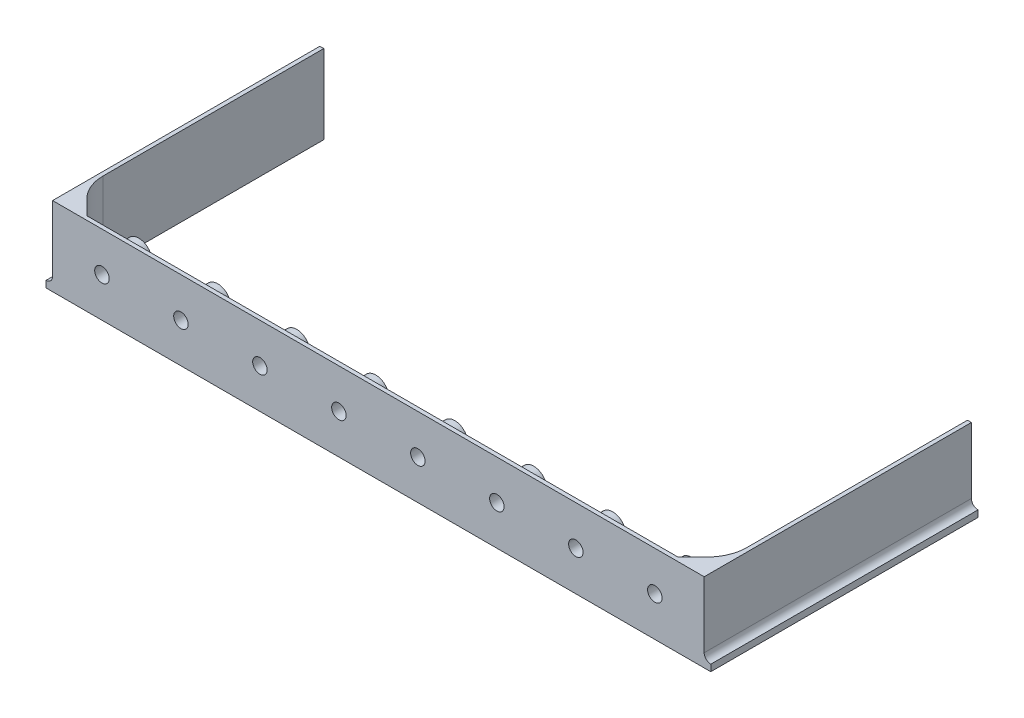
ISO-10303-21;
HEADER;
FILE_DESCRIPTION(('STEP AP214'),'2;1');
FILE_NAME('part.step','',(''),(''),'','','');
FILE_SCHEMA(('AUTOMOTIVE_DESIGN { 1 0 10303 214 1 1 1 1 }'));
ENDSEC;
DATA;
#1=APPLICATION_CONTEXT('core data for automotive mechanical design processes');
#2=APPLICATION_PROTOCOL_DEFINITION('international standard','automotive_design',2000,#1);
#3=PRODUCT_CONTEXT('',#1,'mechanical');
#4=PRODUCT('Part','Part','',(#3));
#5=PRODUCT_RELATED_PRODUCT_CATEGORY('part','',(#4));
#6=PRODUCT_DEFINITION_FORMATION('','',#4);
#7=PRODUCT_DEFINITION_CONTEXT('part definition',#1,'design');
#8=PRODUCT_DEFINITION('design','',#6,#7);
#9=PRODUCT_DEFINITION_SHAPE('','',#8);
#10=(LENGTH_UNIT() NAMED_UNIT(*) SI_UNIT(.MILLI.,.METRE.));
#11=(NAMED_UNIT(*) PLANE_ANGLE_UNIT() SI_UNIT($,.RADIAN.));
#12=(NAMED_UNIT(*) SI_UNIT($,.STERADIAN.) SOLID_ANGLE_UNIT());
#13=UNCERTAINTY_MEASURE_WITH_UNIT(LENGTH_MEASURE(1.E-05),#10,'distance_accuracy_value','');
#14=(GEOMETRIC_REPRESENTATION_CONTEXT(3) GLOBAL_UNCERTAINTY_ASSIGNED_CONTEXT((#13)) GLOBAL_UNIT_ASSIGNED_CONTEXT((#10,
#11,#12)) REPRESENTATION_CONTEXT('',''));
#15=CARTESIAN_POINT('',(0.,0.,0.));
#16=DIRECTION('',(0.,0.,1.));
#17=DIRECTION('',(1.,0.,0.));
#18=AXIS2_PLACEMENT_3D('',#15,#16,#17);
#19=CARTESIAN_POINT('',(495.,0.,3.));
#20=DIRECTION('',(-1.,0.,0.));
#21=DIRECTION('',(0.,0.,1.));
#22=AXIS2_PLACEMENT_3D('',#19,#20,#21);
#23=PLANE('',#22);
#24=DIRECTION('',(0.,1.,0.));
#25=VECTOR('',#24,1.);
#26=CARTESIAN_POINT('',(495.,0.,3.));
#27=LINE('',#26,#25);
#28=CARTESIAN_POINT('',(495.,10.,3.));
#29=VERTEX_POINT('',#28);
#30=CARTESIAN_POINT('',(495.,60.,3.));
#31=VERTEX_POINT('',#30);
#32=EDGE_CURVE('E170',#29,#31,#27,.T.);
#33=ORIENTED_EDGE('',*,*,#32,.F.);
#34=DIRECTION('',(0.,0.,1.));
#35=VECTOR('',#34,1.);
#36=CARTESIAN_POINT('',(495.,10.,-200.));
#37=LINE('',#36,#35);
#38=CARTESIAN_POINT('',(495.,10.,-200.));
#39=VERTEX_POINT('',#38);
#40=EDGE_CURVE('E69',#29,#39,#37,.F.);
#41=ORIENTED_EDGE('',*,*,#40,.T.);
#42=DIRECTION('',(0.,-1.,0.));
#43=VECTOR('',#42,1.);
#44=CARTESIAN_POINT('',(495.,60.,-200.));
#45=LINE('',#44,#43);
#46=CARTESIAN_POINT('',(495.,60.,-200.));
#47=VERTEX_POINT('',#46);
#48=EDGE_CURVE('E378',#47,#39,#45,.T.);
#49=ORIENTED_EDGE('',*,*,#48,.F.);
#50=DIRECTION('',(0.,0.,-1.));
#51=VECTOR('',#50,1.);
#52=CARTESIAN_POINT('',(495.,60.,3.));
#53=LINE('',#52,#51);
#54=EDGE_CURVE('E416',#31,#47,#53,.T.);
#55=ORIENTED_EDGE('',*,*,#54,.F.);
#56=EDGE_LOOP('',(#33,#41,#49,#55));
#57=FACE_BOUND('',#56,.T.);
#58=ADVANCED_FACE('F47',(#57),#23,.F.);
#59=CARTESIAN_POINT('',(0.,0.,3.));
#60=DIRECTION('',(1.,0.,0.));
#61=DIRECTION('',(0.,0.,-1.));
#62=AXIS2_PLACEMENT_3D('',#59,#60,#61);
#63=PLANE('',#62);
#64=DIRECTION('',(0.,1.,0.));
#65=VECTOR('',#64,1.);
#66=CARTESIAN_POINT('',(0.,60.,-200.));
#67=LINE('',#66,#65);
#68=CARTESIAN_POINT('',(0.,10.,-200.));
#69=VERTEX_POINT('',#68);
#70=CARTESIAN_POINT('',(0.,60.,-200.));
#71=VERTEX_POINT('',#70);
#72=EDGE_CURVE('E375',#69,#71,#67,.T.);
#73=ORIENTED_EDGE('',*,*,#72,.F.);
#74=DIRECTION('',(0.,0.,-1.));
#75=VECTOR('',#74,1.);
#76=CARTESIAN_POINT('',(0.,10.,3.));
#77=LINE('',#76,#75);
#78=CARTESIAN_POINT('',(0.,10.,3.));
#79=VERTEX_POINT('',#78);
#80=EDGE_CURVE('E445',#69,#79,#77,.F.);
#81=ORIENTED_EDGE('',*,*,#80,.T.);
#82=DIRECTION('',(0.,-1.,0.));
#83=VECTOR('',#82,1.);
#84=CARTESIAN_POINT('',(0.,0.,3.));
#85=LINE('',#84,#83);
#86=CARTESIAN_POINT('',(0.,60.,3.));
#87=VERTEX_POINT('',#86);
#88=EDGE_CURVE('E171',#87,#79,#85,.T.);
#89=ORIENTED_EDGE('',*,*,#88,.F.);
#90=DIRECTION('',(0.,0.,-1.));
#91=VECTOR('',#90,1.);
#92=CARTESIAN_POINT('',(0.,60.,3.));
#93=LINE('',#92,#91);
#94=EDGE_CURVE('E407',#87,#71,#93,.T.);
#95=ORIENTED_EDGE('',*,*,#94,.T.);
#96=EDGE_LOOP('',(#73,#81,#89,#95));
#97=FACE_BOUND('',#96,.T.);
#98=ADVANCED_FACE('F469',(#97),#63,.F.);
#99=CARTESIAN_POINT('',(0.,0.,0.));
#100=DIRECTION('',(0.,0.,-1.));
#101=DIRECTION('',(-1.,0.,0.));
#102=AXIS2_PLACEMENT_3D('',#99,#100,#101);
#103=PLANE('',#102);
#104=CARTESIAN_POINT('',(37.5,30.,0.));
#105=DIRECTION('',(0.,0.,-1.));
#106=DIRECTION('',(-1.,0.,0.));
#107=AXIS2_PLACEMENT_3D('',#104,#105,#106);
#108=CIRCLE('',#107,9.99999999999998);
#109=CARTESIAN_POINT('',(27.5000000000001,30.,0.));
#110=VERTEX_POINT('',#109);
#111=EDGE_CURVE('E214',#110,#110,#108,.T.);
#112=ORIENTED_EDGE('',*,*,#111,.F.);
#113=EDGE_LOOP('',(#112));
#114=FACE_BOUND('',#113,.T.);
#115=CARTESIAN_POINT('',(97.5,30.,0.));
#116=DIRECTION('',(0.,0.,-1.));
#117=DIRECTION('',(-1.,0.,0.));
#118=AXIS2_PLACEMENT_3D('',#115,#116,#117);
#119=CIRCLE('',#118,9.99999999999998);
#120=CARTESIAN_POINT('',(87.5000000000001,30.,0.));
#121=VERTEX_POINT('',#120);
#122=EDGE_CURVE('E270',#121,#121,#119,.T.);
#123=ORIENTED_EDGE('',*,*,#122,.F.);
#124=EDGE_LOOP('',(#123));
#125=FACE_BOUND('',#124,.T.);
#126=CARTESIAN_POINT('',(157.5,30.,0.));
#127=DIRECTION('',(0.,0.,-1.));
#128=DIRECTION('',(-1.,0.,0.));
#129=AXIS2_PLACEMENT_3D('',#126,#127,#128);
#130=CIRCLE('',#129,9.99999999999998);
#131=CARTESIAN_POINT('',(147.5,30.,0.));
#132=VERTEX_POINT('',#131);
#133=EDGE_CURVE('E278',#132,#132,#130,.T.);
#134=ORIENTED_EDGE('',*,*,#133,.F.);
#135=EDGE_LOOP('',(#134));
#136=FACE_BOUND('',#135,.T.);
#137=CARTESIAN_POINT('',(217.5,30.,0.));
#138=DIRECTION('',(0.,0.,-1.));
#139=DIRECTION('',(-1.,0.,0.));
#140=AXIS2_PLACEMENT_3D('',#137,#138,#139);
#141=CIRCLE('',#140,9.99999999999998);
#142=CARTESIAN_POINT('',(207.5,30.,0.));
#143=VERTEX_POINT('',#142);
#144=EDGE_CURVE('E286',#143,#143,#141,.T.);
#145=ORIENTED_EDGE('',*,*,#144,.F.);
#146=EDGE_LOOP('',(#145));
#147=FACE_BOUND('',#146,.T.);
#148=CARTESIAN_POINT('',(277.5,30.,0.));
#149=DIRECTION('',(0.,0.,-1.));
#150=DIRECTION('',(-1.,0.,0.));
#151=AXIS2_PLACEMENT_3D('',#148,#149,#150);
#152=CIRCLE('',#151,9.99999999999998);
#153=CARTESIAN_POINT('',(267.5,30.,0.));
#154=VERTEX_POINT('',#153);
#155=EDGE_CURVE('E294',#154,#154,#152,.T.);
#156=ORIENTED_EDGE('',*,*,#155,.F.);
#157=EDGE_LOOP('',(#156));
#158=FACE_BOUND('',#157,.T.);
#159=CARTESIAN_POINT('',(337.5,30.,0.));
#160=DIRECTION('',(0.,0.,-1.));
#161=DIRECTION('',(-1.,0.,0.));
#162=AXIS2_PLACEMENT_3D('',#159,#160,#161);
#163=CIRCLE('',#162,9.99999999999998);
#164=CARTESIAN_POINT('',(327.5,30.,0.));
#165=VERTEX_POINT('',#164);
#166=EDGE_CURVE('E302',#165,#165,#163,.T.);
#167=ORIENTED_EDGE('',*,*,#166,.F.);
#168=EDGE_LOOP('',(#167));
#169=FACE_BOUND('',#168,.T.);
#170=CARTESIAN_POINT('',(397.5,30.,0.));
#171=DIRECTION('',(0.,0.,-1.));
#172=DIRECTION('',(-1.,0.,0.));
#173=AXIS2_PLACEMENT_3D('',#170,#171,#172);
#174=CIRCLE('',#173,9.99999999999998);
#175=CARTESIAN_POINT('',(387.5,30.,0.));
#176=VERTEX_POINT('',#175);
#177=EDGE_CURVE('E310',#176,#176,#174,.T.);
#178=ORIENTED_EDGE('',*,*,#177,.F.);
#179=EDGE_LOOP('',(#178));
#180=FACE_BOUND('',#179,.T.);
#181=CARTESIAN_POINT('',(457.5,30.,0.));
#182=DIRECTION('',(0.,0.,-1.));
#183=DIRECTION('',(-1.,0.,0.));
#184=AXIS2_PLACEMENT_3D('',#181,#182,#183);
#185=CIRCLE('',#184,9.99999999999998);
#186=CARTESIAN_POINT('',(447.5,30.,0.));
#187=VERTEX_POINT('',#186);
#188=EDGE_CURVE('E326',#187,#187,#185,.T.);
#189=ORIENTED_EDGE('',*,*,#188,.F.);
#190=EDGE_LOOP('',(#189));
#191=FACE_BOUND('',#190,.T.);
#192=DIRECTION('',(0.,-1.,0.));
#193=VECTOR('',#192,1.);
#194=CARTESIAN_POINT('',(472.,60.,0.));
#195=LINE('',#194,#193);
#196=CARTESIAN_POINT('',(472.,60.,0.));
#197=VERTEX_POINT('',#196);
#198=CARTESIAN_POINT('',(472.,0.,0.));
#199=VERTEX_POINT('',#198);
#200=EDGE_CURVE('E334',#197,#199,#195,.T.);
#201=ORIENTED_EDGE('',*,*,#200,.T.);
#202=DIRECTION('',(1.,0.,0.));
#203=VECTOR('',#202,1.);
#204=CARTESIAN_POINT('',(0.,0.,0.));
#205=LINE('',#204,#203);
#206=CARTESIAN_POINT('',(23.,0.,0.));
#207=VERTEX_POINT('',#206);
#208=EDGE_CURVE('E398',#207,#199,#205,.T.);
#209=ORIENTED_EDGE('',*,*,#208,.F.);
#210=DIRECTION('',(0.,-1.,0.));
#211=VECTOR('',#210,1.);
#212=CARTESIAN_POINT('',(23.,60.,0.));
#213=LINE('',#212,#211);
#214=CARTESIAN_POINT('',(23.,60.,0.));
#215=VERTEX_POINT('',#214);
#216=EDGE_CURVE('E352',#215,#207,#213,.T.);
#217=ORIENTED_EDGE('',*,*,#216,.F.);
#218=DIRECTION('',(-1.,0.,0.));
#219=VECTOR('',#218,1.);
#220=CARTESIAN_POINT('',(0.,60.,0.));
#221=LINE('',#220,#219);
#222=EDGE_CURVE('E400',#197,#215,#221,.T.);
#223=ORIENTED_EDGE('',*,*,#222,.F.);
#224=EDGE_LOOP('',(#201,#209,#217,#223));
#225=FACE_BOUND('',#224,.T.);
#226=ADVANCED_FACE('F495',(#114,#125,#136,#147,#158,#169,#180,#191,#225),#103,.T.);
#227=CARTESIAN_POINT('',(0.,0.,3.));
#228=DIRECTION('',(0.,1.,0.));
#229=DIRECTION('',(0.,0.,1.));
#230=AXIS2_PLACEMENT_3D('',#227,#228,#229);
#231=PLANE('',#230);
#232=ORIENTED_EDGE('',*,*,#208,.T.);
#233=DIRECTION('',(0.707106781186548,0.,-0.707106781186547));
#234=VECTOR('',#233,1.);
#235=CARTESIAN_POINT('',(492.,0.,-20.));
#236=LINE('',#235,#234);
#237=CARTESIAN_POINT('',(483.213203435596,0.,-11.2132034355964));
#238=VERTEX_POINT('',#237);
#239=EDGE_CURVE('E341',#199,#238,#236,.T.);
#240=ORIENTED_EDGE('',*,*,#239,.T.);
#241=CARTESIAN_POINT('',(462.,0.,-32.4264068711928));
#242=DIRECTION('',(0.,1.,0.));
#243=DIRECTION('',(0.,0.,1.));
#244=AXIS2_PLACEMENT_3D('',#241,#242,#243);
#245=CIRCLE('',#244,30.);
#246=CARTESIAN_POINT('',(492.,0.,-32.4264068711928));
#247=VERTEX_POINT('',#246);
#248=EDGE_CURVE('E433',#238,#247,#245,.T.);
#249=ORIENTED_EDGE('',*,*,#248,.T.);
#250=DIRECTION('',(0.,0.,1.));
#251=VECTOR('',#250,1.);
#252=CARTESIAN_POINT('',(492.,0.,-200.));
#253=LINE('',#252,#251);
#254=CARTESIAN_POINT('',(492.,0.,-200.));
#255=VERTEX_POINT('',#254);
#256=EDGE_CURVE('E394',#255,#247,#253,.T.);
#257=ORIENTED_EDGE('',*,*,#256,.F.);
#258=DIRECTION('',(-1.,0.,0.));
#259=VECTOR('',#258,1.);
#260=CARTESIAN_POINT('',(495.,0.,-200.));
#261=LINE('',#260,#259);
#262=CARTESIAN_POINT('',(500.,0.,-200.));
#263=VERTEX_POINT('',#262);
#264=EDGE_CURVE('E178',#263,#255,#261,.T.);
#265=ORIENTED_EDGE('',*,*,#264,.F.);
#266=DIRECTION('',(0.,0.,-1.));
#267=VECTOR('',#266,1.);
#268=CARTESIAN_POINT('',(500.,0.,3.));
#269=LINE('',#268,#267);
#270=CARTESIAN_POINT('',(500.,0.,3.));
#271=VERTEX_POINT('',#270);
#272=EDGE_CURVE('E174',#271,#263,#269,.T.);
#273=ORIENTED_EDGE('',*,*,#272,.F.);
#274=DIRECTION('',(1.,0.,0.));
#275=VECTOR('',#274,1.);
#276=CARTESIAN_POINT('',(0.,0.,3.));
#277=LINE('',#276,#275);
#278=CARTESIAN_POINT('',(-5.,0.,3.));
#279=VERTEX_POINT('',#278);
#280=EDGE_CURVE('E158',#279,#271,#277,.T.);
#281=ORIENTED_EDGE('',*,*,#280,.F.);
#282=DIRECTION('',(0.,0.,1.));
#283=VECTOR('',#282,1.);
#284=CARTESIAN_POINT('',(-5.,0.,-200.));
#285=LINE('',#284,#283);
#286=CARTESIAN_POINT('',(-5.,0.,-200.));
#287=VERTEX_POINT('',#286);
#288=EDGE_CURVE('E200',#287,#279,#285,.T.);
#289=ORIENTED_EDGE('',*,*,#288,.F.);
#290=DIRECTION('',(-1.,0.,0.));
#291=VECTOR('',#290,1.);
#292=CARTESIAN_POINT('',(0.,0.,-200.));
#293=LINE('',#292,#291);
#294=CARTESIAN_POINT('',(2.99999999999999,0.,-200.));
#295=VERTEX_POINT('',#294);
#296=EDGE_CURVE('E366',#295,#287,#293,.T.);
#297=ORIENTED_EDGE('',*,*,#296,.F.);
#298=DIRECTION('',(0.,0.,1.));
#299=VECTOR('',#298,1.);
#300=CARTESIAN_POINT('',(2.99999999999999,0.,-200.));
#301=LINE('',#300,#299);
#302=CARTESIAN_POINT('',(2.99999999999999,0.,-32.4264068711928));
#303=VERTEX_POINT('',#302);
#304=EDGE_CURVE('E362',#295,#303,#301,.T.);
#305=ORIENTED_EDGE('',*,*,#304,.T.);
#306=CARTESIAN_POINT('',(33.,0.,-32.4264068711928));
#307=DIRECTION('',(0.,1.,0.));
#308=DIRECTION('',(0.,0.,1.));
#309=AXIS2_PLACEMENT_3D('',#306,#307,#308);
#310=CIRCLE('',#309,30.);
#311=CARTESIAN_POINT('',(11.7867965644036,0.,-11.2132034355964));
#312=VERTEX_POINT('',#311);
#313=EDGE_CURVE('E439',#303,#312,#310,.T.);
#314=ORIENTED_EDGE('',*,*,#313,.T.);
#315=DIRECTION('',(0.707106781186548,0.,0.707106781186548));
#316=VECTOR('',#315,1.);
#317=CARTESIAN_POINT('',(2.99999999999999,0.,-20.));
#318=LINE('',#317,#316);
#319=EDGE_CURVE('E345',#312,#207,#318,.T.);
#320=ORIENTED_EDGE('',*,*,#319,.T.);
#321=EDGE_LOOP('',(#232,#240,#249,#257,#265,#273,#281,#289,#297,#305,#314,#320));
#322=FACE_BOUND('',#321,.T.);
#323=ADVANCED_FACE('F176',(#322),#231,.F.);
#324=CARTESIAN_POINT('',(0.,60.,3.));
#325=DIRECTION('',(0.,-1.,0.));
#326=DIRECTION('',(0.,0.,-1.));
#327=AXIS2_PLACEMENT_3D('',#324,#325,#326);
#328=PLANE('',#327);
#329=DIRECTION('',(0.707106781186548,0.,-0.707106781186547));
#330=VECTOR('',#329,1.);
#331=CARTESIAN_POINT('',(492.,60.,-20.));
#332=LINE('',#331,#330);
#333=CARTESIAN_POINT('',(483.213203435596,60.,-11.2132034355964));
#334=VERTEX_POINT('',#333);
#335=EDGE_CURVE('E340',#197,#334,#332,.T.);
#336=ORIENTED_EDGE('',*,*,#335,.F.);
#337=ORIENTED_EDGE('',*,*,#222,.T.);
#338=DIRECTION('',(0.707106781186548,0.,0.707106781186548));
#339=VECTOR('',#338,1.);
#340=CARTESIAN_POINT('',(2.99999999999999,60.,-20.));
#341=LINE('',#340,#339);
#342=CARTESIAN_POINT('',(11.7867965644036,60.,-11.2132034355964));
#343=VERTEX_POINT('',#342);
#344=EDGE_CURVE('E349',#343,#215,#341,.T.);
#345=ORIENTED_EDGE('',*,*,#344,.F.);
#346=CARTESIAN_POINT('',(33.,60.,-32.4264068711928));
#347=DIRECTION('',(0.,-1.,0.));
#348=DIRECTION('',(0.,0.,-1.));
#349=AXIS2_PLACEMENT_3D('',#346,#347,#348);
#350=CIRCLE('',#349,30.);
#351=CARTESIAN_POINT('',(3.,60.,-32.4264068711928));
#352=VERTEX_POINT('',#351);
#353=EDGE_CURVE('E442',#343,#352,#350,.T.);
#354=ORIENTED_EDGE('',*,*,#353,.T.);
#355=DIRECTION('',(0.,0.,1.));
#356=VECTOR('',#355,1.);
#357=CARTESIAN_POINT('',(3.,60.,-200.));
#358=LINE('',#357,#356);
#359=CARTESIAN_POINT('',(3.,60.,-200.));
#360=VERTEX_POINT('',#359);
#361=EDGE_CURVE('E358',#360,#352,#358,.T.);
#362=ORIENTED_EDGE('',*,*,#361,.F.);
#363=DIRECTION('',(1.,0.,0.));
#364=VECTOR('',#363,1.);
#365=CARTESIAN_POINT('',(0.,60.,-200.));
#366=LINE('',#365,#364);
#367=EDGE_CURVE('E372',#71,#360,#366,.T.);
#368=ORIENTED_EDGE('',*,*,#367,.F.);
#369=ORIENTED_EDGE('',*,*,#94,.F.);
#370=DIRECTION('',(-1.,0.,0.));
#371=VECTOR('',#370,1.);
#372=CARTESIAN_POINT('',(0.,60.,3.));
#373=LINE('',#372,#371);
#374=EDGE_CURVE('E404',#31,#87,#373,.T.);
#375=ORIENTED_EDGE('',*,*,#374,.F.);
#376=ORIENTED_EDGE('',*,*,#54,.T.);
#377=DIRECTION('',(1.,0.,0.));
#378=VECTOR('',#377,1.);
#379=CARTESIAN_POINT('',(495.,60.,-200.));
#380=LINE('',#379,#378);
#381=CARTESIAN_POINT('',(492.,60.,-200.));
#382=VERTEX_POINT('',#381);
#383=EDGE_CURVE('E386',#382,#47,#380,.T.);
#384=ORIENTED_EDGE('',*,*,#383,.F.);
#385=DIRECTION('',(0.,0.,1.));
#386=VECTOR('',#385,1.);
#387=CARTESIAN_POINT('',(492.,60.,-200.));
#388=LINE('',#387,#386);
#389=CARTESIAN_POINT('',(492.,60.,-32.4264068711928));
#390=VERTEX_POINT('',#389);
#391=EDGE_CURVE('E390',#382,#390,#388,.T.);
#392=ORIENTED_EDGE('',*,*,#391,.T.);
#393=CARTESIAN_POINT('',(462.,60.,-32.4264068711928));
#394=DIRECTION('',(0.,-1.,0.));
#395=DIRECTION('',(0.,0.,-1.));
#396=AXIS2_PLACEMENT_3D('',#393,#394,#395);
#397=CIRCLE('',#396,30.);
#398=EDGE_CURVE('E436',#390,#334,#397,.T.);
#399=ORIENTED_EDGE('',*,*,#398,.T.);
#400=EDGE_LOOP('',(#336,#337,#345,#354,#362,#368,#369,#375,#376,#384,#392,#399));
#401=FACE_BOUND('',#400,.T.);
#402=ADVANCED_FACE('F476',(#401),#328,.F.);
#403=CARTESIAN_POINT('',(0.,0.,3.));
#404=DIRECTION('',(0.,0.,-1.));
#405=DIRECTION('',(-1.,0.,0.));
#406=AXIS2_PLACEMENT_3D('',#403,#404,#405);
#407=PLANE('',#406);
#408=CARTESIAN_POINT('',(397.5,30.,3.));
#409=DIRECTION('',(0.,0.,-1.));
#410=DIRECTION('',(-1.,0.,0.));
#411=AXIS2_PLACEMENT_3D('',#408,#409,#410);
#412=CIRCLE('',#411,5.50000000000002);
#413=CARTESIAN_POINT('',(392.,30.,3.));
#414=VERTEX_POINT('',#413);
#415=EDGE_CURVE('E210',#414,#414,#412,.T.);
#416=ORIENTED_EDGE('',*,*,#415,.T.);
#417=EDGE_LOOP('',(#416));
#418=FACE_BOUND('',#417,.T.);
#419=CARTESIAN_POINT('',(337.5,30.,3.));
#420=DIRECTION('',(0.,0.,-1.));
#421=DIRECTION('',(-1.,0.,0.));
#422=AXIS2_PLACEMENT_3D('',#419,#420,#421);
#423=CIRCLE('',#422,5.50000000000002);
#424=CARTESIAN_POINT('',(332.,30.,3.));
#425=VERTEX_POINT('',#424);
#426=EDGE_CURVE('E219',#425,#425,#423,.T.);
#427=ORIENTED_EDGE('',*,*,#426,.T.);
#428=EDGE_LOOP('',(#427));
#429=FACE_BOUND('',#428,.T.);
#430=CARTESIAN_POINT('',(277.5,30.,3.));
#431=DIRECTION('',(0.,0.,-1.));
#432=DIRECTION('',(-1.,0.,0.));
#433=AXIS2_PLACEMENT_3D('',#430,#431,#432);
#434=CIRCLE('',#433,5.50000000000002);
#435=CARTESIAN_POINT('',(272.,30.,3.));
#436=VERTEX_POINT('',#435);
#437=EDGE_CURVE('E227',#436,#436,#434,.T.);
#438=ORIENTED_EDGE('',*,*,#437,.T.);
#439=EDGE_LOOP('',(#438));
#440=FACE_BOUND('',#439,.T.);
#441=CARTESIAN_POINT('',(217.5,30.,3.));
#442=DIRECTION('',(0.,0.,-1.));
#443=DIRECTION('',(-1.,0.,0.));
#444=AXIS2_PLACEMENT_3D('',#441,#442,#443);
#445=CIRCLE('',#444,5.50000000000002);
#446=CARTESIAN_POINT('',(212.,30.,3.));
#447=VERTEX_POINT('',#446);
#448=EDGE_CURVE('E235',#447,#447,#445,.T.);
#449=ORIENTED_EDGE('',*,*,#448,.T.);
#450=EDGE_LOOP('',(#449));
#451=FACE_BOUND('',#450,.T.);
#452=CARTESIAN_POINT('',(157.5,30.,3.));
#453=DIRECTION('',(0.,0.,-1.));
#454=DIRECTION('',(-1.,0.,0.));
#455=AXIS2_PLACEMENT_3D('',#452,#453,#454);
#456=CIRCLE('',#455,5.50000000000002);
#457=CARTESIAN_POINT('',(152.,30.,3.));
#458=VERTEX_POINT('',#457);
#459=EDGE_CURVE('E243',#458,#458,#456,.T.);
#460=ORIENTED_EDGE('',*,*,#459,.T.);
#461=EDGE_LOOP('',(#460));
#462=FACE_BOUND('',#461,.T.);
#463=CARTESIAN_POINT('',(97.5,30.,3.));
#464=DIRECTION('',(0.,0.,-1.));
#465=DIRECTION('',(-1.,0.,0.));
#466=AXIS2_PLACEMENT_3D('',#463,#464,#465);
#467=CIRCLE('',#466,5.50000000000002);
#468=CARTESIAN_POINT('',(92.,30.,3.));
#469=VERTEX_POINT('',#468);
#470=EDGE_CURVE('E251',#469,#469,#467,.T.);
#471=ORIENTED_EDGE('',*,*,#470,.T.);
#472=EDGE_LOOP('',(#471));
#473=FACE_BOUND('',#472,.T.);
#474=CARTESIAN_POINT('',(37.5,30.,3.));
#475=DIRECTION('',(0.,0.,-1.));
#476=DIRECTION('',(-1.,0.,0.));
#477=AXIS2_PLACEMENT_3D('',#474,#475,#476);
#478=CIRCLE('',#477,5.50000000000002);
#479=CARTESIAN_POINT('',(32.,30.,3.));
#480=VERTEX_POINT('',#479);
#481=EDGE_CURVE('E259',#480,#480,#478,.T.);
#482=ORIENTED_EDGE('',*,*,#481,.T.);
#483=EDGE_LOOP('',(#482));
#484=FACE_BOUND('',#483,.T.);
#485=CARTESIAN_POINT('',(457.5,30.,3.));
#486=DIRECTION('',(0.,0.,-1.));
#487=DIRECTION('',(-1.,0.,0.));
#488=AXIS2_PLACEMENT_3D('',#485,#486,#487);
#489=CIRCLE('',#488,5.50000000000002);
#490=CARTESIAN_POINT('',(452.,30.,3.));
#491=VERTEX_POINT('',#490);
#492=EDGE_CURVE('E322',#491,#491,#489,.T.);
#493=ORIENTED_EDGE('',*,*,#492,.T.);
#494=EDGE_LOOP('',(#493));
#495=FACE_BOUND('',#494,.T.);
#496=ORIENTED_EDGE('',*,*,#88,.T.);
#497=CARTESIAN_POINT('',(-5.,10.,3.));
#498=DIRECTION('',(0.,0.,-1.));
#499=DIRECTION('',(-1.,0.,0.));
#500=AXIS2_PLACEMENT_3D('',#497,#498,#499);
#501=CIRCLE('',#500,5.);
#502=CARTESIAN_POINT('',(-5.,5.,3.));
#503=VERTEX_POINT('',#502);
#504=EDGE_CURVE('E451',#79,#503,#501,.T.);
#505=ORIENTED_EDGE('',*,*,#504,.T.);
#506=DIRECTION('',(0.,1.,0.));
#507=VECTOR('',#506,1.);
#508=CARTESIAN_POINT('',(-5.,0.,3.));
#509=LINE('',#508,#507);
#510=EDGE_CURVE('E165',#279,#503,#509,.T.);
#511=ORIENTED_EDGE('',*,*,#510,.F.);
#512=ORIENTED_EDGE('',*,*,#280,.T.);
#513=DIRECTION('',(0.,-1.,0.));
#514=VECTOR('',#513,1.);
#515=CARTESIAN_POINT('',(500.,0.,3.));
#516=LINE('',#515,#514);
#517=CARTESIAN_POINT('',(500.,5.,3.));
#518=VERTEX_POINT('',#517);
#519=EDGE_CURVE('E163',#518,#271,#516,.T.);
#520=ORIENTED_EDGE('',*,*,#519,.F.);
#521=CARTESIAN_POINT('',(500.,10.,3.));
#522=DIRECTION('',(0.,0.,-1.));
#523=DIRECTION('',(-1.,0.,0.));
#524=AXIS2_PLACEMENT_3D('',#521,#522,#523);
#525=CIRCLE('',#524,5.);
#526=EDGE_CURVE('E56',#518,#29,#525,.T.);
#527=ORIENTED_EDGE('',*,*,#526,.T.);
#528=ORIENTED_EDGE('',*,*,#32,.T.);
#529=ORIENTED_EDGE('',*,*,#374,.T.);
#530=EDGE_LOOP('',(#496,#505,#511,#512,#520,#527,#528,#529));
#531=FACE_BOUND('',#530,.T.);
#532=ADVANCED_FACE('F161',(#418,#429,#440,#451,#462,#473,#484,#495,#531),#407,.F.);
#533=CARTESIAN_POINT('',(492.,60.,-200.));
#534=DIRECTION('',(1.,0.,0.));
#535=DIRECTION('',(0.,0.,-1.));
#536=AXIS2_PLACEMENT_3D('',#533,#534,#535);
#537=PLANE('',#536);
#538=ORIENTED_EDGE('',*,*,#256,.T.);
#539=DIRECTION('',(0.,-1.,0.));
#540=VECTOR('',#539,1.);
#541=CARTESIAN_POINT('',(492.,60.,-32.4264068711928));
#542=LINE('',#541,#540);
#543=EDGE_CURVE('E423',#247,#390,#542,.F.);
#544=ORIENTED_EDGE('',*,*,#543,.T.);
#545=ORIENTED_EDGE('',*,*,#391,.F.);
#546=DIRECTION('',(0.,1.,0.));
#547=VECTOR('',#546,1.);
#548=CARTESIAN_POINT('',(492.,60.,-200.));
#549=LINE('',#548,#547);
#550=EDGE_CURVE('E383',#255,#382,#549,.T.);
#551=ORIENTED_EDGE('',*,*,#550,.F.);
#552=EDGE_LOOP('',(#538,#544,#545,#551));
#553=FACE_BOUND('',#552,.T.);
#554=ADVANCED_FACE('F506',(#553),#537,.F.);
#555=CARTESIAN_POINT('',(0.,0.,-200.));
#556=DIRECTION('',(0.,0.,-1.));
#557=DIRECTION('',(-1.,0.,0.));
#558=AXIS2_PLACEMENT_3D('',#555,#556,#557);
#559=PLANE('',#558);
#560=ORIENTED_EDGE('',*,*,#48,.T.);
#561=CARTESIAN_POINT('',(500.,10.,-200.));
#562=DIRECTION('',(0.,0.,-1.));
#563=DIRECTION('',(-1.,0.,0.));
#564=AXIS2_PLACEMENT_3D('',#561,#562,#563);
#565=CIRCLE('',#564,5.);
#566=CARTESIAN_POINT('',(500.,5.,-200.));
#567=VERTEX_POINT('',#566);
#568=EDGE_CURVE('E11',#39,#567,#565,.F.);
#569=ORIENTED_EDGE('',*,*,#568,.T.);
#570=DIRECTION('',(0.,1.,0.));
#571=VECTOR('',#570,1.);
#572=CARTESIAN_POINT('',(500.,0.,-200.));
#573=LINE('',#572,#571);
#574=EDGE_CURVE('E183',#263,#567,#573,.T.);
#575=ORIENTED_EDGE('',*,*,#574,.F.);
#576=ORIENTED_EDGE('',*,*,#264,.T.);
#577=ORIENTED_EDGE('',*,*,#550,.T.);
#578=ORIENTED_EDGE('',*,*,#383,.T.);
#579=EDGE_LOOP('',(#560,#569,#575,#576,#577,#578));
#580=FACE_BOUND('',#579,.T.);
#581=ADVANCED_FACE('F510',(#580),#559,.T.);
#582=CARTESIAN_POINT('',(3.,60.,-200.));
#583=DIRECTION('',(-1.,0.,0.));
#584=DIRECTION('',(0.,-1.,0.));
#585=AXIS2_PLACEMENT_3D('',#582,#583,#584);
#586=PLANE('',#585);
#587=ORIENTED_EDGE('',*,*,#361,.T.);
#588=DIRECTION('',(0.,-1.,0.));
#589=VECTOR('',#588,1.);
#590=CARTESIAN_POINT('',(3.,60.,-32.4264068711928));
#591=LINE('',#590,#589);
#592=EDGE_CURVE('E426',#352,#303,#591,.T.);
#593=ORIENTED_EDGE('',*,*,#592,.T.);
#594=ORIENTED_EDGE('',*,*,#304,.F.);
#595=DIRECTION('',(0.,-1.,0.));
#596=VECTOR('',#595,1.);
#597=CARTESIAN_POINT('',(3.,60.,-200.));
#598=LINE('',#597,#596);
#599=EDGE_CURVE('E369',#360,#295,#598,.T.);
#600=ORIENTED_EDGE('',*,*,#599,.F.);
#601=EDGE_LOOP('',(#587,#593,#594,#600));
#602=FACE_BOUND('',#601,.T.);
#603=ADVANCED_FACE('F481',(#602),#586,.F.);
#604=CARTESIAN_POINT('',(0.,0.,-200.));
#605=DIRECTION('',(0.,0.,1.));
#606=DIRECTION('',(1.,0.,0.));
#607=AXIS2_PLACEMENT_3D('',#604,#605,#606);
#608=PLANE('',#607);
#609=ORIENTED_EDGE('',*,*,#296,.T.);
#610=DIRECTION('',(0.,-1.,0.));
#611=VECTOR('',#610,1.);
#612=CARTESIAN_POINT('',(-5.,0.,-200.));
#613=LINE('',#612,#611);
#614=CARTESIAN_POINT('',(-5.,5.,-200.));
#615=VERTEX_POINT('',#614);
#616=EDGE_CURVE('E196',#615,#287,#613,.T.);
#617=ORIENTED_EDGE('',*,*,#616,.F.);
#618=CARTESIAN_POINT('',(-5.,10.,-200.));
#619=DIRECTION('',(0.,0.,1.));
#620=DIRECTION('',(1.,0.,0.));
#621=AXIS2_PLACEMENT_3D('',#618,#619,#620);
#622=CIRCLE('',#621,5.);
#623=EDGE_CURVE('E448',#615,#69,#622,.T.);
#624=ORIENTED_EDGE('',*,*,#623,.T.);
#625=ORIENTED_EDGE('',*,*,#72,.T.);
#626=ORIENTED_EDGE('',*,*,#367,.T.);
#627=ORIENTED_EDGE('',*,*,#599,.T.);
#628=EDGE_LOOP('',(#609,#617,#624,#625,#626,#627));
#629=FACE_BOUND('',#628,.T.);
#630=ADVANCED_FACE('F467',(#629),#608,.F.);
#631=CARTESIAN_POINT('',(2.99999999999999,60.,-20.));
#632=DIRECTION('',(0.707106781186547,0.,-0.707106781186547));
#633=DIRECTION('',(-0.707106781186548,0.,-0.707106781186548));
#634=AXIS2_PLACEMENT_3D('',#631,#632,#633);
#635=PLANE('',#634);
#636=ORIENTED_EDGE('',*,*,#319,.F.);
#637=DIRECTION('',(0.,-1.,0.));
#638=VECTOR('',#637,1.);
#639=CARTESIAN_POINT('',(11.7867965644036,60.,-11.2132034355964));
#640=LINE('',#639,#638);
#641=EDGE_CURVE('E430',#312,#343,#640,.F.);
#642=ORIENTED_EDGE('',*,*,#641,.T.);
#643=ORIENTED_EDGE('',*,*,#344,.T.);
#644=ORIENTED_EDGE('',*,*,#216,.T.);
#645=EDGE_LOOP('',(#636,#642,#643,#644));
#646=FACE_BOUND('',#645,.T.);
#647=ADVANCED_FACE('F487',(#646),#635,.T.);
#648=CARTESIAN_POINT('',(492.,60.,-20.));
#649=DIRECTION('',(-0.707106781186547,0.,-0.707106781186548));
#650=DIRECTION('',(-0.707106781186548,0.,0.707106781186547));
#651=AXIS2_PLACEMENT_3D('',#648,#649,#650);
#652=PLANE('',#651);
#653=ORIENTED_EDGE('',*,*,#335,.T.);
#654=DIRECTION('',(0.,-1.,0.));
#655=VECTOR('',#654,1.);
#656=CARTESIAN_POINT('',(483.213203435596,60.,-11.2132034355964));
#657=LINE('',#656,#655);
#658=EDGE_CURVE('E419',#334,#238,#657,.T.);
#659=ORIENTED_EDGE('',*,*,#658,.T.);
#660=ORIENTED_EDGE('',*,*,#239,.F.);
#661=ORIENTED_EDGE('',*,*,#200,.F.);
#662=EDGE_LOOP('',(#653,#659,#660,#661));
#663=FACE_BOUND('',#662,.T.);
#664=ADVANCED_FACE('F498',(#663),#652,.T.);
#665=CARTESIAN_POINT('',(457.5,30.,-25.));
#666=DIRECTION('',(0.,0.,1.));
#667=DIRECTION('',(1.,0.,0.));
#668=AXIS2_PLACEMENT_3D('',#665,#666,#667);
#669=CYLINDRICAL_SURFACE('',#668,9.99999999999998);
#670=CARTESIAN_POINT('',(457.5,30.,-25.));
#671=DIRECTION('',(0.,0.,-1.));
#672=DIRECTION('',(-1.,0.,0.));
#673=AXIS2_PLACEMENT_3D('',#670,#671,#672);
#674=CIRCLE('',#673,9.99999999999998);
#675=CARTESIAN_POINT('',(447.5,30.,-25.));
#676=VERTEX_POINT('',#675);
#677=EDGE_CURVE('E330',#676,#676,#674,.T.);
#678=ORIENTED_EDGE('',*,*,#677,.F.);
#679=EDGE_LOOP('',(#678));
#680=FACE_BOUND('',#679,.T.);
#681=ORIENTED_EDGE('',*,*,#188,.T.);
#682=EDGE_LOOP('',(#681));
#683=FACE_BOUND('',#682,.T.);
#684=ADVANCED_FACE('F633',(#680,#683),#669,.T.);
#685=CARTESIAN_POINT('',(457.5,30.,-25.));
#686=DIRECTION('',(0.,0.,-1.));
#687=DIRECTION('',(-1.,0.,0.));
#688=AXIS2_PLACEMENT_3D('',#685,#686,#687);
#689=PLANE('',#688);
#690=CARTESIAN_POINT('',(457.5,30.,-25.));
#691=DIRECTION('',(0.,0.,-1.));
#692=DIRECTION('',(-1.,0.,0.));
#693=AXIS2_PLACEMENT_3D('',#690,#691,#692);
#694=CIRCLE('',#693,5.50000000000002);
#695=CARTESIAN_POINT('',(452.,30.,-25.));
#696=VERTEX_POINT('',#695);
#697=EDGE_CURVE('E318',#696,#696,#694,.T.);
#698=ORIENTED_EDGE('',*,*,#697,.F.);
#699=EDGE_LOOP('',(#698));
#700=FACE_BOUND('',#699,.T.);
#701=ORIENTED_EDGE('',*,*,#677,.T.);
#702=EDGE_LOOP('',(#701));
#703=FACE_BOUND('',#702,.T.);
#704=ADVANCED_FACE('F629',(#700,#703),#689,.T.);
#705=CARTESIAN_POINT('',(457.5,30.,3.));
#706=DIRECTION('',(0.,0.,-1.));
#707=DIRECTION('',(-1.,0.,0.));
#708=AXIS2_PLACEMENT_3D('',#705,#706,#707);
#709=CYLINDRICAL_SURFACE('',#708,5.50000000000002);
#710=ORIENTED_EDGE('',*,*,#492,.F.);
#711=EDGE_LOOP('',(#710));
#712=FACE_BOUND('',#711,.T.);
#713=ORIENTED_EDGE('',*,*,#697,.T.);
#714=EDGE_LOOP('',(#713));
#715=FACE_BOUND('',#714,.T.);
#716=ADVANCED_FACE('F625',(#712,#715),#709,.F.);
#717=CARTESIAN_POINT('',(397.5,30.,-25.));
#718=DIRECTION('',(0.,0.,1.));
#719=DIRECTION('',(1.,0.,0.));
#720=AXIS2_PLACEMENT_3D('',#717,#718,#719);
#721=CYLINDRICAL_SURFACE('',#720,9.99999999999998);
#722=CARTESIAN_POINT('',(397.5,30.,-25.));
#723=DIRECTION('',(0.,0.,-1.));
#724=DIRECTION('',(-1.,0.,0.));
#725=AXIS2_PLACEMENT_3D('',#722,#723,#724);
#726=CIRCLE('',#725,9.99999999999998);
#727=CARTESIAN_POINT('',(387.5,30.,-25.));
#728=VERTEX_POINT('',#727);
#729=EDGE_CURVE('E314',#728,#728,#726,.T.);
#730=ORIENTED_EDGE('',*,*,#729,.F.);
#731=EDGE_LOOP('',(#730));
#732=FACE_BOUND('',#731,.T.);
#733=ORIENTED_EDGE('',*,*,#177,.T.);
#734=EDGE_LOOP('',(#733));
#735=FACE_BOUND('',#734,.T.);
#736=ADVANCED_FACE('F621',(#732,#735),#721,.T.);
#737=CARTESIAN_POINT('',(397.5,30.,-25.));
#738=DIRECTION('',(0.,0.,-1.));
#739=DIRECTION('',(-1.,0.,0.));
#740=AXIS2_PLACEMENT_3D('',#737,#738,#739);
#741=PLANE('',#740);
#742=CARTESIAN_POINT('',(397.5,30.,-25.));
#743=DIRECTION('',(0.,0.,-1.));
#744=DIRECTION('',(-1.,0.,0.));
#745=AXIS2_PLACEMENT_3D('',#742,#743,#744);
#746=CIRCLE('',#745,5.50000000000002);
#747=CARTESIAN_POINT('',(392.,30.,-25.));
#748=VERTEX_POINT('',#747);
#749=EDGE_CURVE('E215',#748,#748,#746,.T.);
#750=ORIENTED_EDGE('',*,*,#749,.F.);
#751=EDGE_LOOP('',(#750));
#752=FACE_BOUND('',#751,.T.);
#753=ORIENTED_EDGE('',*,*,#729,.T.);
#754=EDGE_LOOP('',(#753));
#755=FACE_BOUND('',#754,.T.);
#756=ADVANCED_FACE('F617',(#752,#755),#741,.T.);
#757=CARTESIAN_POINT('',(337.5,30.,-25.));
#758=DIRECTION('',(0.,0.,1.));
#759=DIRECTION('',(1.,0.,0.));
#760=AXIS2_PLACEMENT_3D('',#757,#758,#759);
#761=CYLINDRICAL_SURFACE('',#760,9.99999999999998);
#762=CARTESIAN_POINT('',(337.5,30.,-25.));
#763=DIRECTION('',(0.,0.,-1.));
#764=DIRECTION('',(-1.,0.,0.));
#765=AXIS2_PLACEMENT_3D('',#762,#763,#764);
#766=CIRCLE('',#765,9.99999999999998);
#767=CARTESIAN_POINT('',(327.5,30.,-25.));
#768=VERTEX_POINT('',#767);
#769=EDGE_CURVE('E306',#768,#768,#766,.T.);
#770=ORIENTED_EDGE('',*,*,#769,.F.);
#771=EDGE_LOOP('',(#770));
#772=FACE_BOUND('',#771,.T.);
#773=ORIENTED_EDGE('',*,*,#166,.T.);
#774=EDGE_LOOP('',(#773));
#775=FACE_BOUND('',#774,.T.);
#776=ADVANCED_FACE('F613',(#772,#775),#761,.T.);
#777=CARTESIAN_POINT('',(337.5,30.,-25.));
#778=DIRECTION('',(0.,0.,-1.));
#779=DIRECTION('',(-1.,0.,0.));
#780=AXIS2_PLACEMENT_3D('',#777,#778,#779);
#781=PLANE('',#780);
#782=CARTESIAN_POINT('',(337.5,30.,-25.));
#783=DIRECTION('',(0.,0.,-1.));
#784=DIRECTION('',(-1.,0.,0.));
#785=AXIS2_PLACEMENT_3D('',#782,#783,#784);
#786=CIRCLE('',#785,5.50000000000002);
#787=CARTESIAN_POINT('',(332.,30.,-25.));
#788=VERTEX_POINT('',#787);
#789=EDGE_CURVE('E223',#788,#788,#786,.T.);
#790=ORIENTED_EDGE('',*,*,#789,.F.);
#791=EDGE_LOOP('',(#790));
#792=FACE_BOUND('',#791,.T.);
#793=ORIENTED_EDGE('',*,*,#769,.T.);
#794=EDGE_LOOP('',(#793));
#795=FACE_BOUND('',#794,.T.);
#796=ADVANCED_FACE('F609',(#792,#795),#781,.T.);
#797=CARTESIAN_POINT('',(277.5,30.,-25.));
#798=DIRECTION('',(0.,0.,1.));
#799=DIRECTION('',(1.,0.,0.));
#800=AXIS2_PLACEMENT_3D('',#797,#798,#799);
#801=CYLINDRICAL_SURFACE('',#800,9.99999999999998);
#802=CARTESIAN_POINT('',(277.5,30.,-25.));
#803=DIRECTION('',(0.,0.,-1.));
#804=DIRECTION('',(-1.,0.,0.));
#805=AXIS2_PLACEMENT_3D('',#802,#803,#804);
#806=CIRCLE('',#805,9.99999999999998);
#807=CARTESIAN_POINT('',(267.5,30.,-25.));
#808=VERTEX_POINT('',#807);
#809=EDGE_CURVE('E298',#808,#808,#806,.T.);
#810=ORIENTED_EDGE('',*,*,#809,.F.);
#811=EDGE_LOOP('',(#810));
#812=FACE_BOUND('',#811,.T.);
#813=ORIENTED_EDGE('',*,*,#155,.T.);
#814=EDGE_LOOP('',(#813));
#815=FACE_BOUND('',#814,.T.);
#816=ADVANCED_FACE('F605',(#812,#815),#801,.T.);
#817=CARTESIAN_POINT('',(277.5,30.,-25.));
#818=DIRECTION('',(0.,0.,-1.));
#819=DIRECTION('',(-1.,0.,0.));
#820=AXIS2_PLACEMENT_3D('',#817,#818,#819);
#821=PLANE('',#820);
#822=CARTESIAN_POINT('',(277.5,30.,-25.));
#823=DIRECTION('',(0.,0.,-1.));
#824=DIRECTION('',(-1.,0.,0.));
#825=AXIS2_PLACEMENT_3D('',#822,#823,#824);
#826=CIRCLE('',#825,5.50000000000002);
#827=CARTESIAN_POINT('',(272.,30.,-25.));
#828=VERTEX_POINT('',#827);
#829=EDGE_CURVE('E231',#828,#828,#826,.T.);
#830=ORIENTED_EDGE('',*,*,#829,.F.);
#831=EDGE_LOOP('',(#830));
#832=FACE_BOUND('',#831,.T.);
#833=ORIENTED_EDGE('',*,*,#809,.T.);
#834=EDGE_LOOP('',(#833));
#835=FACE_BOUND('',#834,.T.);
#836=ADVANCED_FACE('F601',(#832,#835),#821,.T.);
#837=CARTESIAN_POINT('',(217.5,30.,-25.));
#838=DIRECTION('',(0.,0.,1.));
#839=DIRECTION('',(1.,0.,0.));
#840=AXIS2_PLACEMENT_3D('',#837,#838,#839);
#841=CYLINDRICAL_SURFACE('',#840,9.99999999999998);
#842=CARTESIAN_POINT('',(217.5,30.,-25.));
#843=DIRECTION('',(0.,0.,-1.));
#844=DIRECTION('',(-1.,0.,0.));
#845=AXIS2_PLACEMENT_3D('',#842,#843,#844);
#846=CIRCLE('',#845,9.99999999999998);
#847=CARTESIAN_POINT('',(207.5,30.,-25.));
#848=VERTEX_POINT('',#847);
#849=EDGE_CURVE('E290',#848,#848,#846,.T.);
#850=ORIENTED_EDGE('',*,*,#849,.F.);
#851=EDGE_LOOP('',(#850));
#852=FACE_BOUND('',#851,.T.);
#853=ORIENTED_EDGE('',*,*,#144,.T.);
#854=EDGE_LOOP('',(#853));
#855=FACE_BOUND('',#854,.T.);
#856=ADVANCED_FACE('F597',(#852,#855),#841,.T.);
#857=CARTESIAN_POINT('',(217.5,30.,-25.));
#858=DIRECTION('',(0.,0.,-1.));
#859=DIRECTION('',(-1.,0.,0.));
#860=AXIS2_PLACEMENT_3D('',#857,#858,#859);
#861=PLANE('',#860);
#862=CARTESIAN_POINT('',(217.5,30.,-25.));
#863=DIRECTION('',(0.,0.,-1.));
#864=DIRECTION('',(-1.,0.,0.));
#865=AXIS2_PLACEMENT_3D('',#862,#863,#864);
#866=CIRCLE('',#865,5.50000000000002);
#867=CARTESIAN_POINT('',(212.,30.,-25.));
#868=VERTEX_POINT('',#867);
#869=EDGE_CURVE('E239',#868,#868,#866,.T.);
#870=ORIENTED_EDGE('',*,*,#869,.F.);
#871=EDGE_LOOP('',(#870));
#872=FACE_BOUND('',#871,.T.);
#873=ORIENTED_EDGE('',*,*,#849,.T.);
#874=EDGE_LOOP('',(#873));
#875=FACE_BOUND('',#874,.T.);
#876=ADVANCED_FACE('F593',(#872,#875),#861,.T.);
#877=CARTESIAN_POINT('',(157.5,30.,-25.));
#878=DIRECTION('',(0.,0.,1.));
#879=DIRECTION('',(1.,0.,0.));
#880=AXIS2_PLACEMENT_3D('',#877,#878,#879);
#881=CYLINDRICAL_SURFACE('',#880,9.99999999999998);
#882=CARTESIAN_POINT('',(157.5,30.,-25.));
#883=DIRECTION('',(0.,0.,-1.));
#884=DIRECTION('',(-1.,0.,0.));
#885=AXIS2_PLACEMENT_3D('',#882,#883,#884);
#886=CIRCLE('',#885,9.99999999999998);
#887=CARTESIAN_POINT('',(147.5,30.,-25.));
#888=VERTEX_POINT('',#887);
#889=EDGE_CURVE('E282',#888,#888,#886,.T.);
#890=ORIENTED_EDGE('',*,*,#889,.F.);
#891=EDGE_LOOP('',(#890));
#892=FACE_BOUND('',#891,.T.);
#893=ORIENTED_EDGE('',*,*,#133,.T.);
#894=EDGE_LOOP('',(#893));
#895=FACE_BOUND('',#894,.T.);
#896=ADVANCED_FACE('F589',(#892,#895),#881,.T.);
#897=CARTESIAN_POINT('',(157.5,30.,-25.));
#898=DIRECTION('',(0.,0.,-1.));
#899=DIRECTION('',(-1.,0.,0.));
#900=AXIS2_PLACEMENT_3D('',#897,#898,#899);
#901=PLANE('',#900);
#902=CARTESIAN_POINT('',(157.5,30.,-25.));
#903=DIRECTION('',(0.,0.,-1.));
#904=DIRECTION('',(-1.,0.,0.));
#905=AXIS2_PLACEMENT_3D('',#902,#903,#904);
#906=CIRCLE('',#905,5.50000000000002);
#907=CARTESIAN_POINT('',(152.,30.,-25.));
#908=VERTEX_POINT('',#907);
#909=EDGE_CURVE('E247',#908,#908,#906,.T.);
#910=ORIENTED_EDGE('',*,*,#909,.F.);
#911=EDGE_LOOP('',(#910));
#912=FACE_BOUND('',#911,.T.);
#913=ORIENTED_EDGE('',*,*,#889,.T.);
#914=EDGE_LOOP('',(#913));
#915=FACE_BOUND('',#914,.T.);
#916=ADVANCED_FACE('F585',(#912,#915),#901,.T.);
#917=CARTESIAN_POINT('',(97.5,30.,-25.));
#918=DIRECTION('',(0.,0.,1.));
#919=DIRECTION('',(1.,0.,0.));
#920=AXIS2_PLACEMENT_3D('',#917,#918,#919);
#921=CYLINDRICAL_SURFACE('',#920,9.99999999999998);
#922=CARTESIAN_POINT('',(97.5,30.,-25.));
#923=DIRECTION('',(0.,0.,-1.));
#924=DIRECTION('',(-1.,0.,0.));
#925=AXIS2_PLACEMENT_3D('',#922,#923,#924);
#926=CIRCLE('',#925,9.99999999999998);
#927=CARTESIAN_POINT('',(87.5000000000001,30.,-25.));
#928=VERTEX_POINT('',#927);
#929=EDGE_CURVE('E274',#928,#928,#926,.T.);
#930=ORIENTED_EDGE('',*,*,#929,.F.);
#931=EDGE_LOOP('',(#930));
#932=FACE_BOUND('',#931,.T.);
#933=ORIENTED_EDGE('',*,*,#122,.T.);
#934=EDGE_LOOP('',(#933));
#935=FACE_BOUND('',#934,.T.);
#936=ADVANCED_FACE('F581',(#932,#935),#921,.T.);
#937=CARTESIAN_POINT('',(97.5,30.,-25.));
#938=DIRECTION('',(0.,0.,-1.));
#939=DIRECTION('',(-1.,0.,0.));
#940=AXIS2_PLACEMENT_3D('',#937,#938,#939);
#941=PLANE('',#940);
#942=CARTESIAN_POINT('',(97.5,30.,-25.));
#943=DIRECTION('',(0.,0.,-1.));
#944=DIRECTION('',(-1.,0.,0.));
#945=AXIS2_PLACEMENT_3D('',#942,#943,#944);
#946=CIRCLE('',#945,5.50000000000002);
#947=CARTESIAN_POINT('',(92.,30.,-25.));
#948=VERTEX_POINT('',#947);
#949=EDGE_CURVE('E255',#948,#948,#946,.T.);
#950=ORIENTED_EDGE('',*,*,#949,.F.);
#951=EDGE_LOOP('',(#950));
#952=FACE_BOUND('',#951,.T.);
#953=ORIENTED_EDGE('',*,*,#929,.T.);
#954=EDGE_LOOP('',(#953));
#955=FACE_BOUND('',#954,.T.);
#956=ADVANCED_FACE('F577',(#952,#955),#941,.T.);
#957=CARTESIAN_POINT('',(37.5,30.,-25.));
#958=DIRECTION('',(0.,0.,1.));
#959=DIRECTION('',(1.,0.,0.));
#960=AXIS2_PLACEMENT_3D('',#957,#958,#959);
#961=CYLINDRICAL_SURFACE('',#960,9.99999999999998);
#962=CARTESIAN_POINT('',(37.5,30.,-25.));
#963=DIRECTION('',(0.,0.,-1.));
#964=DIRECTION('',(-1.,0.,0.));
#965=AXIS2_PLACEMENT_3D('',#962,#963,#964);
#966=CIRCLE('',#965,9.99999999999998);
#967=CARTESIAN_POINT('',(27.5000000000001,30.,-25.));
#968=VERTEX_POINT('',#967);
#969=EDGE_CURVE('E266',#968,#968,#966,.T.);
#970=ORIENTED_EDGE('',*,*,#969,.F.);
#971=EDGE_LOOP('',(#970));
#972=FACE_BOUND('',#971,.T.);
#973=ORIENTED_EDGE('',*,*,#111,.T.);
#974=EDGE_LOOP('',(#973));
#975=FACE_BOUND('',#974,.T.);
#976=ADVANCED_FACE('F573',(#972,#975),#961,.T.);
#977=CARTESIAN_POINT('',(37.5,30.,-25.));
#978=DIRECTION('',(0.,0.,-1.));
#979=DIRECTION('',(-1.,0.,0.));
#980=AXIS2_PLACEMENT_3D('',#977,#978,#979);
#981=PLANE('',#980);
#982=CARTESIAN_POINT('',(37.5,30.,-25.));
#983=DIRECTION('',(0.,0.,-1.));
#984=DIRECTION('',(-1.,0.,0.));
#985=AXIS2_PLACEMENT_3D('',#982,#983,#984);
#986=CIRCLE('',#985,5.50000000000002);
#987=CARTESIAN_POINT('',(32.,30.,-25.));
#988=VERTEX_POINT('',#987);
#989=EDGE_CURVE('E209',#988,#988,#986,.T.);
#990=ORIENTED_EDGE('',*,*,#989,.F.);
#991=EDGE_LOOP('',(#990));
#992=FACE_BOUND('',#991,.T.);
#993=ORIENTED_EDGE('',*,*,#969,.T.);
#994=EDGE_LOOP('',(#993));
#995=FACE_BOUND('',#994,.T.);
#996=ADVANCED_FACE('F569',(#992,#995),#981,.T.);
#997=CARTESIAN_POINT('',(37.5,30.,3.));
#998=DIRECTION('',(0.,0.,-1.));
#999=DIRECTION('',(-1.,0.,0.));
#1000=AXIS2_PLACEMENT_3D('',#997,#998,#999);
#1001=CYLINDRICAL_SURFACE('',#1000,5.50000000000002);
#1002=ORIENTED_EDGE('',*,*,#481,.F.);
#1003=EDGE_LOOP('',(#1002));
#1004=FACE_BOUND('',#1003,.T.);
#1005=ORIENTED_EDGE('',*,*,#989,.T.);
#1006=EDGE_LOOP('',(#1005));
#1007=FACE_BOUND('',#1006,.T.);
#1008=ADVANCED_FACE('F565',(#1004,#1007),#1001,.F.);
#1009=CARTESIAN_POINT('',(97.5,30.,3.));
#1010=DIRECTION('',(0.,0.,-1.));
#1011=DIRECTION('',(-1.,0.,0.));
#1012=AXIS2_PLACEMENT_3D('',#1009,#1010,#1011);
#1013=CYLINDRICAL_SURFACE('',#1012,5.50000000000002);
#1014=ORIENTED_EDGE('',*,*,#470,.F.);
#1015=EDGE_LOOP('',(#1014));
#1016=FACE_BOUND('',#1015,.T.);
#1017=ORIENTED_EDGE('',*,*,#949,.T.);
#1018=EDGE_LOOP('',(#1017));
#1019=FACE_BOUND('',#1018,.T.);
#1020=ADVANCED_FACE('F561',(#1016,#1019),#1013,.F.);
#1021=CARTESIAN_POINT('',(157.5,30.,3.));
#1022=DIRECTION('',(0.,0.,-1.));
#1023=DIRECTION('',(-1.,0.,0.));
#1024=AXIS2_PLACEMENT_3D('',#1021,#1022,#1023);
#1025=CYLINDRICAL_SURFACE('',#1024,5.50000000000002);
#1026=ORIENTED_EDGE('',*,*,#459,.F.);
#1027=EDGE_LOOP('',(#1026));
#1028=FACE_BOUND('',#1027,.T.);
#1029=ORIENTED_EDGE('',*,*,#909,.T.);
#1030=EDGE_LOOP('',(#1029));
#1031=FACE_BOUND('',#1030,.T.);
#1032=ADVANCED_FACE('F557',(#1028,#1031),#1025,.F.);
#1033=CARTESIAN_POINT('',(217.5,30.,3.));
#1034=DIRECTION('',(0.,0.,-1.));
#1035=DIRECTION('',(-1.,0.,0.));
#1036=AXIS2_PLACEMENT_3D('',#1033,#1034,#1035);
#1037=CYLINDRICAL_SURFACE('',#1036,5.50000000000002);
#1038=ORIENTED_EDGE('',*,*,#448,.F.);
#1039=EDGE_LOOP('',(#1038));
#1040=FACE_BOUND('',#1039,.T.);
#1041=ORIENTED_EDGE('',*,*,#869,.T.);
#1042=EDGE_LOOP('',(#1041));
#1043=FACE_BOUND('',#1042,.T.);
#1044=ADVANCED_FACE('F553',(#1040,#1043),#1037,.F.);
#1045=CARTESIAN_POINT('',(277.5,30.,3.));
#1046=DIRECTION('',(0.,0.,-1.));
#1047=DIRECTION('',(-1.,0.,0.));
#1048=AXIS2_PLACEMENT_3D('',#1045,#1046,#1047);
#1049=CYLINDRICAL_SURFACE('',#1048,5.50000000000002);
#1050=ORIENTED_EDGE('',*,*,#437,.F.);
#1051=EDGE_LOOP('',(#1050));
#1052=FACE_BOUND('',#1051,.T.);
#1053=ORIENTED_EDGE('',*,*,#829,.T.);
#1054=EDGE_LOOP('',(#1053));
#1055=FACE_BOUND('',#1054,.T.);
#1056=ADVANCED_FACE('F549',(#1052,#1055),#1049,.F.);
#1057=CARTESIAN_POINT('',(337.5,30.,3.));
#1058=DIRECTION('',(0.,0.,-1.));
#1059=DIRECTION('',(-1.,0.,0.));
#1060=AXIS2_PLACEMENT_3D('',#1057,#1058,#1059);
#1061=CYLINDRICAL_SURFACE('',#1060,5.50000000000002);
#1062=ORIENTED_EDGE('',*,*,#426,.F.);
#1063=EDGE_LOOP('',(#1062));
#1064=FACE_BOUND('',#1063,.T.);
#1065=ORIENTED_EDGE('',*,*,#789,.T.);
#1066=EDGE_LOOP('',(#1065));
#1067=FACE_BOUND('',#1066,.T.);
#1068=ADVANCED_FACE('F545',(#1064,#1067),#1061,.F.);
#1069=CARTESIAN_POINT('',(397.5,30.,3.));
#1070=DIRECTION('',(0.,0.,-1.));
#1071=DIRECTION('',(-1.,0.,0.));
#1072=AXIS2_PLACEMENT_3D('',#1069,#1070,#1071);
#1073=CYLINDRICAL_SURFACE('',#1072,5.50000000000002);
#1074=ORIENTED_EDGE('',*,*,#415,.F.);
#1075=EDGE_LOOP('',(#1074));
#1076=FACE_BOUND('',#1075,.T.);
#1077=ORIENTED_EDGE('',*,*,#749,.T.);
#1078=EDGE_LOOP('',(#1077));
#1079=FACE_BOUND('',#1078,.T.);
#1080=ADVANCED_FACE('F532',(#1076,#1079),#1073,.F.);
#1081=CARTESIAN_POINT('',(462.,60.,-32.4264068711928));
#1082=DIRECTION('',(0.,-1.,0.));
#1083=DIRECTION('',(0.,0.,-1.));
#1084=AXIS2_PLACEMENT_3D('',#1081,#1082,#1083);
#1085=CYLINDRICAL_SURFACE('',#1084,30.);
#1086=ORIENTED_EDGE('',*,*,#398,.F.);
#1087=ORIENTED_EDGE('',*,*,#543,.F.);
#1088=ORIENTED_EDGE('',*,*,#248,.F.);
#1089=ORIENTED_EDGE('',*,*,#658,.F.);
#1090=EDGE_LOOP('',(#1086,#1087,#1088,#1089));
#1091=FACE_BOUND('',#1090,.T.);
#1092=ADVANCED_FACE('F502',(#1091),#1085,.F.);
#1093=CARTESIAN_POINT('',(33.,60.,-32.4264068711928));
#1094=DIRECTION('',(0.,-1.,0.));
#1095=DIRECTION('',(0.,0.,-1.));
#1096=AXIS2_PLACEMENT_3D('',#1093,#1094,#1095);
#1097=CYLINDRICAL_SURFACE('',#1096,30.);
#1098=ORIENTED_EDGE('',*,*,#353,.F.);
#1099=ORIENTED_EDGE('',*,*,#641,.F.);
#1100=ORIENTED_EDGE('',*,*,#313,.F.);
#1101=ORIENTED_EDGE('',*,*,#592,.F.);
#1102=EDGE_LOOP('',(#1098,#1099,#1100,#1101));
#1103=FACE_BOUND('',#1102,.T.);
#1104=ADVANCED_FACE('F492',(#1103),#1097,.F.);
#1105=CARTESIAN_POINT('',(-5.,0.,0.));
#1106=DIRECTION('',(1.,0.,0.));
#1107=DIRECTION('',(0.,0.,-1.));
#1108=AXIS2_PLACEMENT_3D('',#1105,#1106,#1107);
#1109=PLANE('',#1108);
#1110=ORIENTED_EDGE('',*,*,#616,.T.);
#1111=ORIENTED_EDGE('',*,*,#288,.T.);
#1112=ORIENTED_EDGE('',*,*,#510,.T.);
#1113=DIRECTION('',(0.,0.,-1.));
#1114=VECTOR('',#1113,1.);
#1115=CARTESIAN_POINT('',(-5.,5.,-200.));
#1116=LINE('',#1115,#1114);
#1117=EDGE_CURVE('E205',#503,#615,#1116,.T.);
#1118=ORIENTED_EDGE('',*,*,#1117,.T.);
#1119=EDGE_LOOP('',(#1110,#1111,#1112,#1118));
#1120=FACE_BOUND('',#1119,.T.);
#1121=ADVANCED_FACE('F462',(#1120),#1109,.F.);
#1122=CARTESIAN_POINT('',(500.,0.,0.));
#1123=DIRECTION('',(-1.,0.,0.));
#1124=DIRECTION('',(0.,0.,1.));
#1125=AXIS2_PLACEMENT_3D('',#1122,#1123,#1124);
#1126=PLANE('',#1125);
#1127=ORIENTED_EDGE('',*,*,#519,.T.);
#1128=ORIENTED_EDGE('',*,*,#272,.T.);
#1129=ORIENTED_EDGE('',*,*,#574,.T.);
#1130=DIRECTION('',(0.,0.,1.));
#1131=VECTOR('',#1130,1.);
#1132=CARTESIAN_POINT('',(500.,5.,3.));
#1133=LINE('',#1132,#1131);
#1134=EDGE_CURVE('E188',#567,#518,#1133,.T.);
#1135=ORIENTED_EDGE('',*,*,#1134,.T.);
#1136=EDGE_LOOP('',(#1127,#1128,#1129,#1135));
#1137=FACE_BOUND('',#1136,.T.);
#1138=ADVANCED_FACE('F186',(#1137),#1126,.F.);
#1139=CARTESIAN_POINT('',(-5.,10.,-200.));
#1140=DIRECTION('',(0.,0.,1.));
#1141=DIRECTION('',(1.,0.,0.));
#1142=AXIS2_PLACEMENT_3D('',#1139,#1140,#1141);
#1143=CYLINDRICAL_SURFACE('',#1142,5.);
#1144=ORIENTED_EDGE('',*,*,#504,.F.);
#1145=ORIENTED_EDGE('',*,*,#80,.F.);
#1146=ORIENTED_EDGE('',*,*,#623,.F.);
#1147=ORIENTED_EDGE('',*,*,#1117,.F.);
#1148=EDGE_LOOP('',(#1144,#1145,#1146,#1147));
#1149=FACE_BOUND('',#1148,.T.);
#1150=ADVANCED_FACE('F464',(#1149),#1143,.F.);
#1151=CARTESIAN_POINT('',(500.,10.,3.));
#1152=DIRECTION('',(0.,0.,-1.));
#1153=DIRECTION('',(-1.,0.,0.));
#1154=AXIS2_PLACEMENT_3D('',#1151,#1152,#1153);
#1155=CYLINDRICAL_SURFACE('',#1154,5.);
#1156=ORIENTED_EDGE('',*,*,#568,.F.);
#1157=ORIENTED_EDGE('',*,*,#40,.F.);
#1158=ORIENTED_EDGE('',*,*,#526,.F.);
#1159=ORIENTED_EDGE('',*,*,#1134,.F.);
#1160=EDGE_LOOP('',(#1156,#1157,#1158,#1159));
#1161=FACE_BOUND('',#1160,.T.);
#1162=ADVANCED_FACE('F49',(#1161),#1155,.F.);
#1163=CLOSED_SHELL('',(#58,#98,#226,#323,#402,#532,#554,#581,#603,#630,#647,#664,#684,#704,#716,
#736,#756,#776,#796,#816,#836,#856,#876,#896,#916,#936,#956,#976,#996,#1008,#1020,#1032,#1044,
#1056,#1068,#1080,#1092,#1104,#1121,#1138,#1150,#1162));
#1164=MANIFOLD_SOLID_BREP('B2',#1163);
#1165=ADVANCED_BREP_SHAPE_REPRESENTATION('',(#18,#1164),#14);
#1166=SHAPE_DEFINITION_REPRESENTATION(#9,#1165);
ENDSEC;
END-ISO-10303-21;
